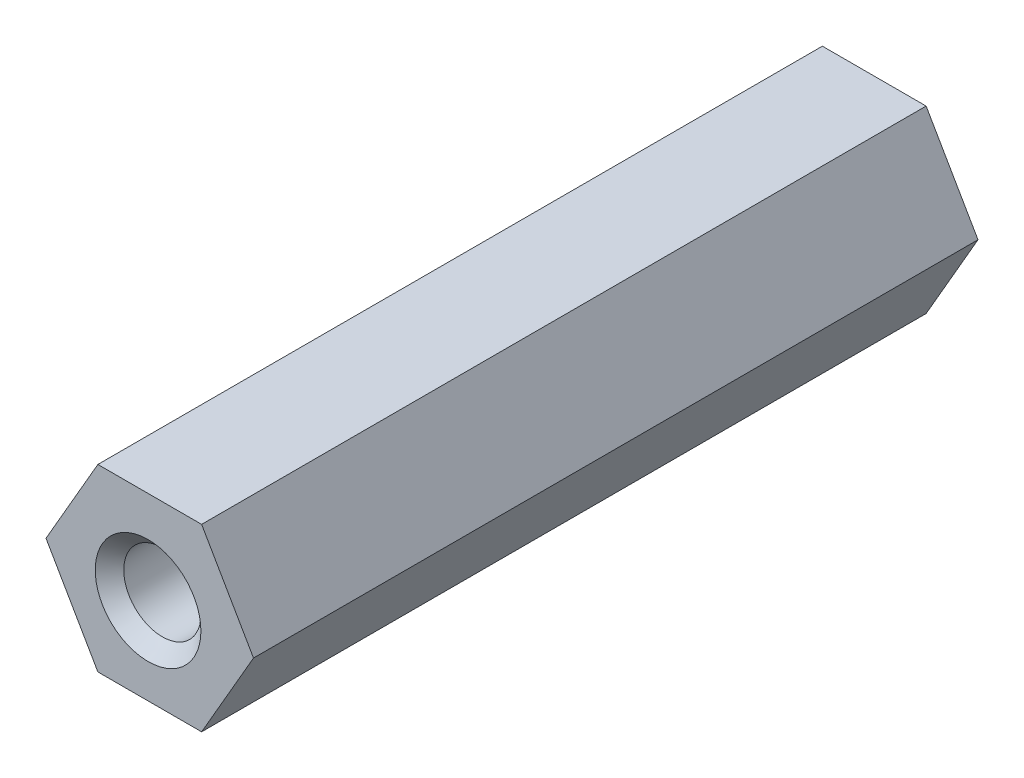
ISO-10303-21;
HEADER;
FILE_DESCRIPTION(('STEP AP214'),'2;1');
FILE_NAME('part.step','',(''),(''),'','','');
FILE_SCHEMA(('AUTOMOTIVE_DESIGN { 1 0 10303 214 1 1 1 1 }'));
ENDSEC;
DATA;
#1=APPLICATION_CONTEXT('core data for automotive mechanical design processes');
#2=APPLICATION_PROTOCOL_DEFINITION('international standard','automotive_design',2000,#1);
#3=PRODUCT_CONTEXT('',#1,'mechanical');
#4=PRODUCT('Part','Part','',(#3));
#5=PRODUCT_RELATED_PRODUCT_CATEGORY('part','',(#4));
#6=PRODUCT_DEFINITION_FORMATION('','',#4);
#7=PRODUCT_DEFINITION_CONTEXT('part definition',#1,'design');
#8=PRODUCT_DEFINITION('design','',#6,#7);
#9=PRODUCT_DEFINITION_SHAPE('','',#8);
#10=(LENGTH_UNIT() NAMED_UNIT(*) SI_UNIT(.MILLI.,.METRE.));
#11=(NAMED_UNIT(*) PLANE_ANGLE_UNIT() SI_UNIT($,.RADIAN.));
#12=(NAMED_UNIT(*) SI_UNIT($,.STERADIAN.) SOLID_ANGLE_UNIT());
#13=UNCERTAINTY_MEASURE_WITH_UNIT(LENGTH_MEASURE(1.E-05),#10,'distance_accuracy_value','');
#14=(GEOMETRIC_REPRESENTATION_CONTEXT(3) GLOBAL_UNCERTAINTY_ASSIGNED_CONTEXT((#13)) GLOBAL_UNIT_ASSIGNED_CONTEXT((#10,
#11,#12)) REPRESENTATION_CONTEXT('',''));
#15=CARTESIAN_POINT('',(0.,0.,0.));
#16=DIRECTION('',(0.,0.,1.));
#17=DIRECTION('',(1.,0.,0.));
#18=AXIS2_PLACEMENT_3D('',#15,#16,#17);
#19=CARTESIAN_POINT('',(1.81865334794732,-3.15,-12.7));
#20=DIRECTION('',(0.866025403784439,-0.5,0.));
#21=DIRECTION('',(0.5,0.866025403784439,0.));
#22=AXIS2_PLACEMENT_3D('',#19,#20,#21);
#23=PLANE('',#22);
#24=DIRECTION('',(0.5,0.866025403784438,0.));
#25=VECTOR('',#24,1.);
#26=CARTESIAN_POINT('',(1.81865334794732,-3.15,12.7));
#27=LINE('',#26,#25);
#28=CARTESIAN_POINT('',(1.81865334794732,-3.15,12.7));
#29=VERTEX_POINT('',#28);
#30=CARTESIAN_POINT('',(3.63730669589464,0.,12.7));
#31=VERTEX_POINT('',#30);
#32=EDGE_CURVE('E122',#29,#31,#27,.T.);
#33=ORIENTED_EDGE('',*,*,#32,.F.);
#34=DIRECTION('',(0.,0.,1.));
#35=VECTOR('',#34,1.);
#36=CARTESIAN_POINT('',(1.81865334794732,-3.15,-12.7));
#37=LINE('',#36,#35);
#38=CARTESIAN_POINT('',(1.81865334794732,-3.15,-12.7));
#39=VERTEX_POINT('',#38);
#40=EDGE_CURVE('E51',#39,#29,#37,.T.);
#41=ORIENTED_EDGE('',*,*,#40,.F.);
#42=DIRECTION('',(0.5,0.866025403784438,0.));
#43=VECTOR('',#42,1.);
#44=CARTESIAN_POINT('',(1.81865334794732,-3.15,-12.7));
#45=LINE('',#44,#43);
#46=CARTESIAN_POINT('',(3.63730669589464,0.,-12.7));
#47=VERTEX_POINT('',#46);
#48=EDGE_CURVE('E137',#39,#47,#45,.T.);
#49=ORIENTED_EDGE('',*,*,#48,.T.);
#50=DIRECTION('',(0.,0.,1.));
#51=VECTOR('',#50,1.);
#52=CARTESIAN_POINT('',(3.63730669589464,0.,-12.7));
#53=LINE('',#52,#51);
#54=EDGE_CURVE('E86',#47,#31,#53,.T.);
#55=ORIENTED_EDGE('',*,*,#54,.T.);
#56=EDGE_LOOP('',(#33,#41,#49,#55));
#57=FACE_BOUND('',#56,.T.);
#58=ADVANCED_FACE('F34',(#57),#23,.T.);
#59=CARTESIAN_POINT('',(-1.81865334794732,-3.15,-12.7));
#60=DIRECTION('',(0.,-1.,0.));
#61=DIRECTION('',(1.,0.,0.));
#62=AXIS2_PLACEMENT_3D('',#59,#60,#61);
#63=PLANE('',#62);
#64=DIRECTION('',(1.,0.,0.));
#65=VECTOR('',#64,1.);
#66=CARTESIAN_POINT('',(-1.81865334794732,-3.15,12.7));
#67=LINE('',#66,#65);
#68=CARTESIAN_POINT('',(-1.81865334794732,-3.15,12.7));
#69=VERTEX_POINT('',#68);
#70=EDGE_CURVE('E134',#69,#29,#67,.T.);
#71=ORIENTED_EDGE('',*,*,#70,.F.);
#72=DIRECTION('',(0.,0.,1.));
#73=VECTOR('',#72,1.);
#74=CARTESIAN_POINT('',(-1.81865334794732,-3.15,-12.7));
#75=LINE('',#74,#73);
#76=CARTESIAN_POINT('',(-1.81865334794732,-3.15,-12.7));
#77=VERTEX_POINT('',#76);
#78=EDGE_CURVE('E74',#77,#69,#75,.T.);
#79=ORIENTED_EDGE('',*,*,#78,.F.);
#80=DIRECTION('',(1.,0.,0.));
#81=VECTOR('',#80,1.);
#82=CARTESIAN_POINT('',(-1.81865334794732,-3.15,-12.7));
#83=LINE('',#82,#81);
#84=EDGE_CURVE('E112',#77,#39,#83,.T.);
#85=ORIENTED_EDGE('',*,*,#84,.T.);
#86=ORIENTED_EDGE('',*,*,#40,.T.);
#87=EDGE_LOOP('',(#71,#79,#85,#86));
#88=FACE_BOUND('',#87,.T.);
#89=ADVANCED_FACE('F163',(#88),#63,.T.);
#90=CARTESIAN_POINT('',(-3.63730669589464,0.,-12.7));
#91=DIRECTION('',(-0.866025403784439,-0.5,0.));
#92=DIRECTION('',(0.5,-0.866025403784439,0.));
#93=AXIS2_PLACEMENT_3D('',#90,#91,#92);
#94=PLANE('',#93);
#95=DIRECTION('',(0.5,-0.866025403784439,0.));
#96=VECTOR('',#95,1.);
#97=CARTESIAN_POINT('',(-3.63730669589464,0.,12.7));
#98=LINE('',#97,#96);
#99=CARTESIAN_POINT('',(-3.63730669589464,0.,12.7));
#100=VERTEX_POINT('',#99);
#101=EDGE_CURVE('E99',#100,#69,#98,.T.);
#102=ORIENTED_EDGE('',*,*,#101,.F.);
#103=DIRECTION('',(0.,0.,1.));
#104=VECTOR('',#103,1.);
#105=CARTESIAN_POINT('',(-3.63730669589464,0.,-12.7));
#106=LINE('',#105,#104);
#107=CARTESIAN_POINT('',(-3.63730669589464,0.,-12.7));
#108=VERTEX_POINT('',#107);
#109=EDGE_CURVE('E94',#108,#100,#106,.T.);
#110=ORIENTED_EDGE('',*,*,#109,.F.);
#111=DIRECTION('',(0.5,-0.866025403784439,0.));
#112=VECTOR('',#111,1.);
#113=CARTESIAN_POINT('',(-3.63730669589464,0.,-12.7));
#114=LINE('',#113,#112);
#115=EDGE_CURVE('E97',#108,#77,#114,.T.);
#116=ORIENTED_EDGE('',*,*,#115,.T.);
#117=ORIENTED_EDGE('',*,*,#78,.T.);
#118=EDGE_LOOP('',(#102,#110,#116,#117));
#119=FACE_BOUND('',#118,.T.);
#120=ADVANCED_FACE('F96',(#119),#94,.T.);
#121=CARTESIAN_POINT('',(-1.81865334794732,3.15,-12.7));
#122=DIRECTION('',(-0.866025403784439,0.5,0.));
#123=DIRECTION('',(-0.5,-0.866025403784439,0.));
#124=AXIS2_PLACEMENT_3D('',#121,#122,#123);
#125=PLANE('',#124);
#126=DIRECTION('',(-0.5,-0.866025403784438,0.));
#127=VECTOR('',#126,1.);
#128=CARTESIAN_POINT('',(-1.81865334794732,3.15,12.7));
#129=LINE('',#128,#127);
#130=CARTESIAN_POINT('',(-1.81865334794732,3.15,12.7));
#131=VERTEX_POINT('',#130);
#132=EDGE_CURVE('E131',#131,#100,#129,.T.);
#133=ORIENTED_EDGE('',*,*,#132,.F.);
#134=DIRECTION('',(0.,0.,1.));
#135=VECTOR('',#134,1.);
#136=CARTESIAN_POINT('',(-1.81865334794732,3.15,-12.7));
#137=LINE('',#136,#135);
#138=CARTESIAN_POINT('',(-1.81865334794732,3.15,-12.7));
#139=VERTEX_POINT('',#138);
#140=EDGE_CURVE('E104',#139,#131,#137,.T.);
#141=ORIENTED_EDGE('',*,*,#140,.F.);
#142=DIRECTION('',(-0.5,-0.866025403784438,0.));
#143=VECTOR('',#142,1.);
#144=CARTESIAN_POINT('',(-1.81865334794732,3.15,-12.7));
#145=LINE('',#144,#143);
#146=EDGE_CURVE('E110',#139,#108,#145,.T.);
#147=ORIENTED_EDGE('',*,*,#146,.T.);
#148=ORIENTED_EDGE('',*,*,#109,.T.);
#149=EDGE_LOOP('',(#133,#141,#147,#148));
#150=FACE_BOUND('',#149,.T.);
#151=ADVANCED_FACE('F114',(#150),#125,.T.);
#152=CARTESIAN_POINT('',(1.81865334794732,3.15,-12.7));
#153=DIRECTION('',(0.,1.,0.));
#154=DIRECTION('',(0.,0.,1.));
#155=AXIS2_PLACEMENT_3D('',#152,#153,#154);
#156=PLANE('',#155);
#157=DIRECTION('',(-1.,0.,0.));
#158=VECTOR('',#157,1.);
#159=CARTESIAN_POINT('',(1.81865334794732,3.15,12.7));
#160=LINE('',#159,#158);
#161=CARTESIAN_POINT('',(1.81865334794732,3.15,12.7));
#162=VERTEX_POINT('',#161);
#163=EDGE_CURVE('E128',#162,#131,#160,.T.);
#164=ORIENTED_EDGE('',*,*,#163,.F.);
#165=DIRECTION('',(0.,0.,1.));
#166=VECTOR('',#165,1.);
#167=CARTESIAN_POINT('',(1.81865334794732,3.15,-12.7));
#168=LINE('',#167,#166);
#169=CARTESIAN_POINT('',(1.81865334794732,3.15,-12.7));
#170=VERTEX_POINT('',#169);
#171=EDGE_CURVE('E142',#170,#162,#168,.T.);
#172=ORIENTED_EDGE('',*,*,#171,.F.);
#173=DIRECTION('',(-1.,0.,0.));
#174=VECTOR('',#173,1.);
#175=CARTESIAN_POINT('',(1.81865334794732,3.15,-12.7));
#176=LINE('',#175,#174);
#177=EDGE_CURVE('E115',#170,#139,#176,.T.);
#178=ORIENTED_EDGE('',*,*,#177,.T.);
#179=ORIENTED_EDGE('',*,*,#140,.T.);
#180=EDGE_LOOP('',(#164,#172,#178,#179));
#181=FACE_BOUND('',#180,.T.);
#182=ADVANCED_FACE('F173',(#181),#156,.T.);
#183=CARTESIAN_POINT('',(3.63730669589464,0.,-12.7));
#184=DIRECTION('',(0.866025403784438,0.5,0.));
#185=DIRECTION('',(-0.5,0.866025403784438,0.));
#186=AXIS2_PLACEMENT_3D('',#183,#184,#185);
#187=PLANE('',#186);
#188=DIRECTION('',(-0.5,0.866025403784438,0.));
#189=VECTOR('',#188,1.);
#190=CARTESIAN_POINT('',(3.63730669589464,0.,12.7));
#191=LINE('',#190,#189);
#192=EDGE_CURVE('E125',#31,#162,#191,.T.);
#193=ORIENTED_EDGE('',*,*,#192,.F.);
#194=ORIENTED_EDGE('',*,*,#54,.F.);
#195=DIRECTION('',(-0.5,0.866025403784438,0.));
#196=VECTOR('',#195,1.);
#197=CARTESIAN_POINT('',(3.63730669589464,0.,-12.7));
#198=LINE('',#197,#196);
#199=EDGE_CURVE('E117',#47,#170,#198,.T.);
#200=ORIENTED_EDGE('',*,*,#199,.T.);
#201=ORIENTED_EDGE('',*,*,#171,.T.);
#202=EDGE_LOOP('',(#193,#194,#200,#201));
#203=FACE_BOUND('',#202,.T.);
#204=ADVANCED_FACE('F170',(#203),#187,.T.);
#205=CARTESIAN_POINT('',(3.63730669589464,0.,-12.7));
#206=DIRECTION('',(0.,0.,1.));
#207=DIRECTION('',(1.,0.,0.));
#208=AXIS2_PLACEMENT_3D('',#205,#206,#207);
#209=PLANE('',#208);
#210=CARTESIAN_POINT('',(-0.0587533379232065,-0.101763766397256,-12.7));
#211=DIRECTION('',(0.,0.,1.));
#212=DIRECTION('',(1.,0.,0.));
#213=AXIS2_PLACEMENT_3D('',#210,#211,#212);
#214=CIRCLE('',#213,1.85254999999999);
#215=CARTESIAN_POINT('',(1.79379666207679,-0.101763766397256,-12.7));
#216=VERTEX_POINT('',#215);
#217=EDGE_CURVE('E43',#216,#216,#214,.T.);
#218=ORIENTED_EDGE('',*,*,#217,.T.);
#219=EDGE_LOOP('',(#218));
#220=FACE_BOUND('',#219,.T.);
#221=ORIENTED_EDGE('',*,*,#48,.F.);
#222=ORIENTED_EDGE('',*,*,#84,.F.);
#223=ORIENTED_EDGE('',*,*,#115,.F.);
#224=ORIENTED_EDGE('',*,*,#146,.F.);
#225=ORIENTED_EDGE('',*,*,#177,.F.);
#226=ORIENTED_EDGE('',*,*,#199,.F.);
#227=EDGE_LOOP('',(#221,#222,#223,#224,#225,#226));
#228=FACE_BOUND('',#227,.T.);
#229=ADVANCED_FACE('F108',(#220,#228),#209,.F.);
#230=CARTESIAN_POINT('',(3.63730669589464,0.,12.7));
#231=DIRECTION('',(0.,0.,1.));
#232=DIRECTION('',(1.,0.,0.));
#233=AXIS2_PLACEMENT_3D('',#230,#231,#232);
#234=PLANE('',#233);
#235=CARTESIAN_POINT('',(-0.0587533379232065,-0.101763766397256,12.7));
#236=DIRECTION('',(0.,0.,1.));
#237=DIRECTION('',(1.,0.,0.));
#238=AXIS2_PLACEMENT_3D('',#235,#236,#237);
#239=CIRCLE('',#238,1.85254999999998);
#240=CARTESIAN_POINT('',(1.79379666207678,-0.101763766397256,12.7));
#241=VERTEX_POINT('',#240);
#242=EDGE_CURVE('E147',#241,#241,#239,.F.);
#243=ORIENTED_EDGE('',*,*,#242,.T.);
#244=EDGE_LOOP('',(#243));
#245=FACE_BOUND('',#244,.T.);
#246=ORIENTED_EDGE('',*,*,#32,.T.);
#247=ORIENTED_EDGE('',*,*,#192,.T.);
#248=ORIENTED_EDGE('',*,*,#163,.T.);
#249=ORIENTED_EDGE('',*,*,#132,.T.);
#250=ORIENTED_EDGE('',*,*,#101,.T.);
#251=ORIENTED_EDGE('',*,*,#70,.T.);
#252=EDGE_LOOP('',(#246,#247,#248,#249,#250,#251));
#253=FACE_BOUND('',#252,.T.);
#254=ADVANCED_FACE('F181',(#245,#253),#234,.T.);
#255=CARTESIAN_POINT('',(-0.0587533379232065,-0.101763766397256,12.7));
#256=DIRECTION('',(0.,0.,1.));
#257=DIRECTION('',(1.,0.,0.));
#258=AXIS2_PLACEMENT_3D('',#255,#256,#257);
#259=CYLINDRICAL_SURFACE('',#258,1.35254999999999);
#260=CARTESIAN_POINT('',(-0.0587533379232065,-0.101763766397256,-12.2));
#261=DIRECTION('',(0.,0.,1.));
#262=DIRECTION('',(1.,0.,0.));
#263=AXIS2_PLACEMENT_3D('',#260,#261,#262);
#264=CIRCLE('',#263,1.35254999999999);
#265=CARTESIAN_POINT('',(1.29379666207678,-0.101763766397256,-12.2));
#266=VERTEX_POINT('',#265);
#267=EDGE_CURVE('E11',#266,#266,#264,.F.);
#268=ORIENTED_EDGE('',*,*,#267,.T.);
#269=EDGE_LOOP('',(#268));
#270=FACE_BOUND('',#269,.T.);
#271=CARTESIAN_POINT('',(-0.0587533379232065,-0.101763766397256,12.2));
#272=DIRECTION('',(0.,0.,1.));
#273=DIRECTION('',(1.,0.,0.));
#274=AXIS2_PLACEMENT_3D('',#271,#272,#273);
#275=CIRCLE('',#274,1.35254999999999);
#276=CARTESIAN_POINT('',(1.29379666207678,-0.101763766397256,12.2));
#277=VERTEX_POINT('',#276);
#278=EDGE_CURVE('E139',#277,#277,#275,.T.);
#279=ORIENTED_EDGE('',*,*,#278,.T.);
#280=EDGE_LOOP('',(#279));
#281=FACE_BOUND('',#280,.T.);
#282=ADVANCED_FACE('F159',(#270,#281),#259,.F.);
#283=CARTESIAN_POINT('',(-0.0587533379232065,-0.101763766397256,12.2));
#284=DIRECTION('',(0.,0.,1.));
#285=DIRECTION('',(1.,0.,0.));
#286=AXIS2_PLACEMENT_3D('',#283,#284,#285);
#287=CONICAL_SURFACE('',#286,1.35254999999999,0.78539816339745);
#288=ORIENTED_EDGE('',*,*,#242,.F.);
#289=EDGE_LOOP('',(#288));
#290=FACE_BOUND('',#289,.T.);
#291=ORIENTED_EDGE('',*,*,#278,.F.);
#292=EDGE_LOOP('',(#291));
#293=FACE_BOUND('',#292,.T.);
#294=ADVANCED_FACE('F154',(#290,#293),#287,.F.);
#295=CARTESIAN_POINT('',(-0.0587533379232065,-0.101763766397256,-12.7));
#296=DIRECTION('',(0.,0.,-1.));
#297=DIRECTION('',(-1.,0.,0.));
#298=AXIS2_PLACEMENT_3D('',#295,#296,#297);
#299=CONICAL_SURFACE('',#298,1.85254999999999,0.785398163397447);
#300=ORIENTED_EDGE('',*,*,#267,.F.);
#301=EDGE_LOOP('',(#300));
#302=FACE_BOUND('',#301,.T.);
#303=ORIENTED_EDGE('',*,*,#217,.F.);
#304=EDGE_LOOP('',(#303));
#305=FACE_BOUND('',#304,.T.);
#306=ADVANCED_FACE('F36',(#302,#305),#299,.F.);
#307=CLOSED_SHELL('',(#58,#89,#120,#151,#182,#204,#229,#254,#282,#294,#306));
#308=MANIFOLD_SOLID_BREP('B2',#307);
#309=ADVANCED_BREP_SHAPE_REPRESENTATION('',(#18,#308),#14);
#310=SHAPE_DEFINITION_REPRESENTATION(#9,#309);
ENDSEC;
END-ISO-10303-21;
